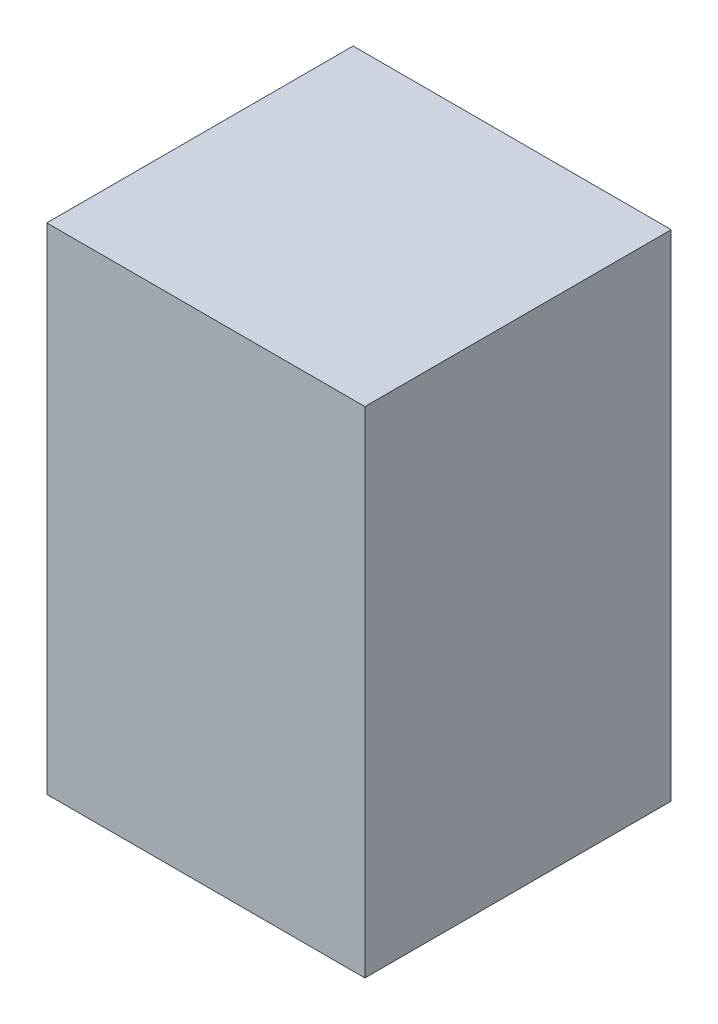
ISO-10303-21;
HEADER;
FILE_DESCRIPTION(('STEP AP214'),'2;1');
FILE_NAME('part.step','',(''),(''),'','','');
FILE_SCHEMA(('AUTOMOTIVE_DESIGN { 1 0 10303 214 1 1 1 1 }'));
ENDSEC;
DATA;
#1=APPLICATION_CONTEXT('core data for automotive mechanical design processes');
#2=APPLICATION_PROTOCOL_DEFINITION('international standard','automotive_design',2000,#1);
#3=PRODUCT_CONTEXT('',#1,'mechanical');
#4=PRODUCT('Part','Part','',(#3));
#5=PRODUCT_RELATED_PRODUCT_CATEGORY('part','',(#4));
#6=PRODUCT_DEFINITION_FORMATION('','',#4);
#7=PRODUCT_DEFINITION_CONTEXT('part definition',#1,'design');
#8=PRODUCT_DEFINITION('design','',#6,#7);
#9=PRODUCT_DEFINITION_SHAPE('','',#8);
#10=(LENGTH_UNIT() NAMED_UNIT(*) SI_UNIT(.MILLI.,.METRE.));
#11=(NAMED_UNIT(*) PLANE_ANGLE_UNIT() SI_UNIT($,.RADIAN.));
#12=(NAMED_UNIT(*) SI_UNIT($,.STERADIAN.) SOLID_ANGLE_UNIT());
#13=UNCERTAINTY_MEASURE_WITH_UNIT(LENGTH_MEASURE(1.E-05),#10,'distance_accuracy_value','');
#14=(GEOMETRIC_REPRESENTATION_CONTEXT(3) GLOBAL_UNCERTAINTY_ASSIGNED_CONTEXT((#13)) GLOBAL_UNIT_ASSIGNED_CONTEXT((#10,
#11,#12)) REPRESENTATION_CONTEXT('',''));
#15=CARTESIAN_POINT('',(0.,0.,0.));
#16=DIRECTION('',(0.,0.,1.));
#17=DIRECTION('',(1.,0.,0.));
#18=AXIS2_PLACEMENT_3D('',#15,#16,#17);
#19=CARTESIAN_POINT('',(0.67499992,1.05000044,1.29999994));
#20=DIRECTION('',(0.,0.,1.));
#21=DIRECTION('',(1.,0.,0.));
#22=AXIS2_PLACEMENT_3D('',#19,#20,#21);
#23=PLANE('',#22);
#24=DIRECTION('',(1.,0.,0.));
#25=VECTOR('',#24,1.);
#26=CARTESIAN_POINT('',(0.67499992,-1.05000044,1.29999994));
#27=LINE('',#26,#25);
#28=CARTESIAN_POINT('',(0.67499992,-1.05000044,1.29999994));
#29=VERTEX_POINT('',#28);
#30=CARTESIAN_POINT('',(-0.67499992,-1.05000044,1.29999994));
#31=VERTEX_POINT('',#30);
#32=EDGE_CURVE('E53',#29,#31,#27,.F.);
#33=ORIENTED_EDGE('',*,*,#32,.F.);
#34=DIRECTION('',(0.,1.,0.));
#35=VECTOR('',#34,1.);
#36=CARTESIAN_POINT('',(0.67499992,1.05000044,1.29999994));
#37=LINE('',#36,#35);
#38=CARTESIAN_POINT('',(0.67499992,1.05000044,1.29999994));
#39=VERTEX_POINT('',#38);
#40=EDGE_CURVE('E68',#39,#29,#37,.F.);
#41=ORIENTED_EDGE('',*,*,#40,.F.);
#42=DIRECTION('',(1.,0.,0.));
#43=VECTOR('',#42,1.);
#44=CARTESIAN_POINT('',(-0.67499992,1.05000044,1.29999994));
#45=LINE('',#44,#43);
#46=CARTESIAN_POINT('',(-0.67499992,1.05000044,1.29999994));
#47=VERTEX_POINT('',#46);
#48=EDGE_CURVE('E20',#47,#39,#45,.T.);
#49=ORIENTED_EDGE('',*,*,#48,.F.);
#50=DIRECTION('',(0.,1.,0.));
#51=VECTOR('',#50,1.);
#52=CARTESIAN_POINT('',(-0.67499992,-1.05000044,1.29999994));
#53=LINE('',#52,#51);
#54=EDGE_CURVE('E58',#31,#47,#53,.T.);
#55=ORIENTED_EDGE('',*,*,#54,.F.);
#56=EDGE_LOOP('',(#33,#41,#49,#55));
#57=FACE_BOUND('',#56,.T.);
#58=ADVANCED_FACE('F17',(#57),#23,.T.);
#59=CARTESIAN_POINT('',(-0.67499992,1.05000044,0.));
#60=DIRECTION('',(0.,1.,0.));
#61=DIRECTION('',(0.,0.,1.));
#62=AXIS2_PLACEMENT_3D('',#59,#60,#61);
#63=PLANE('',#62);
#64=DIRECTION('',(0.,0.,-1.));
#65=VECTOR('',#64,1.);
#66=CARTESIAN_POINT('',(0.67499992,1.05000044,0.));
#67=LINE('',#66,#65);
#68=CARTESIAN_POINT('',(0.67499992,1.05000044,0.));
#69=VERTEX_POINT('',#68);
#70=EDGE_CURVE('E79',#69,#39,#67,.F.);
#71=ORIENTED_EDGE('',*,*,#70,.F.);
#72=DIRECTION('',(1.,0.,0.));
#73=VECTOR('',#72,1.);
#74=CARTESIAN_POINT('',(0.67499992,1.05000044,0.));
#75=LINE('',#74,#73);
#76=CARTESIAN_POINT('',(-0.67499992,1.05000044,0.));
#77=VERTEX_POINT('',#76);
#78=EDGE_CURVE('E74',#69,#77,#75,.F.);
#79=ORIENTED_EDGE('',*,*,#78,.T.);
#80=DIRECTION('',(0.,0.,1.));
#81=VECTOR('',#80,1.);
#82=CARTESIAN_POINT('',(-0.67499992,1.05000044,0.));
#83=LINE('',#82,#81);
#84=EDGE_CURVE('E63',#47,#77,#83,.F.);
#85=ORIENTED_EDGE('',*,*,#84,.F.);
#86=ORIENTED_EDGE('',*,*,#48,.T.);
#87=EDGE_LOOP('',(#71,#79,#85,#86));
#88=FACE_BOUND('',#87,.T.);
#89=ADVANCED_FACE('F73',(#88),#63,.T.);
#90=CARTESIAN_POINT('',(-0.67499992,-1.05000044,0.));
#91=DIRECTION('',(-1.,0.,0.));
#92=DIRECTION('',(0.,0.,1.));
#93=AXIS2_PLACEMENT_3D('',#90,#91,#92);
#94=PLANE('',#93);
#95=ORIENTED_EDGE('',*,*,#84,.T.);
#96=DIRECTION('',(0.,1.,0.));
#97=VECTOR('',#96,1.);
#98=CARTESIAN_POINT('',(-0.67499992,1.05000044,0.));
#99=LINE('',#98,#97);
#100=CARTESIAN_POINT('',(-0.67499992,-1.05000044,0.));
#101=VERTEX_POINT('',#100);
#102=EDGE_CURVE('E84',#77,#101,#99,.F.);
#103=ORIENTED_EDGE('',*,*,#102,.T.);
#104=DIRECTION('',(0.,0.,-1.));
#105=VECTOR('',#104,1.);
#106=CARTESIAN_POINT('',(-0.67499992,-1.05000044,0.));
#107=LINE('',#106,#105);
#108=EDGE_CURVE('E65',#31,#101,#107,.T.);
#109=ORIENTED_EDGE('',*,*,#108,.F.);
#110=ORIENTED_EDGE('',*,*,#54,.T.);
#111=EDGE_LOOP('',(#95,#103,#109,#110));
#112=FACE_BOUND('',#111,.T.);
#113=ADVANCED_FACE('F60',(#112),#94,.T.);
#114=CARTESIAN_POINT('',(0.67499992,-1.05000044,0.));
#115=DIRECTION('',(0.,-1.,0.));
#116=DIRECTION('',(0.,0.,-1.));
#117=AXIS2_PLACEMENT_3D('',#114,#115,#116);
#118=PLANE('',#117);
#119=ORIENTED_EDGE('',*,*,#108,.T.);
#120=DIRECTION('',(1.,0.,0.));
#121=VECTOR('',#120,1.);
#122=CARTESIAN_POINT('',(0.67499992,-1.05000044,0.));
#123=LINE('',#122,#121);
#124=CARTESIAN_POINT('',(0.67499992,-1.05000044,0.));
#125=VERTEX_POINT('',#124);
#126=EDGE_CURVE('E26',#101,#125,#123,.T.);
#127=ORIENTED_EDGE('',*,*,#126,.T.);
#128=DIRECTION('',(0.,0.,-1.));
#129=VECTOR('',#128,1.);
#130=CARTESIAN_POINT('',(0.67499992,-1.05000044,0.));
#131=LINE('',#130,#129);
#132=EDGE_CURVE('E34',#29,#125,#131,.T.);
#133=ORIENTED_EDGE('',*,*,#132,.F.);
#134=ORIENTED_EDGE('',*,*,#32,.T.);
#135=EDGE_LOOP('',(#119,#127,#133,#134));
#136=FACE_BOUND('',#135,.T.);
#137=ADVANCED_FACE('F88',(#136),#118,.T.);
#138=CARTESIAN_POINT('',(0.67499992,1.05000044,0.));
#139=DIRECTION('',(1.,0.,0.));
#140=DIRECTION('',(0.,0.,-1.));
#141=AXIS2_PLACEMENT_3D('',#138,#139,#140);
#142=PLANE('',#141);
#143=ORIENTED_EDGE('',*,*,#132,.T.);
#144=DIRECTION('',(0.,1.,0.));
#145=VECTOR('',#144,1.);
#146=CARTESIAN_POINT('',(0.67499992,1.05000044,0.));
#147=LINE('',#146,#145);
#148=EDGE_CURVE('E11',#125,#69,#147,.T.);
#149=ORIENTED_EDGE('',*,*,#148,.T.);
#150=ORIENTED_EDGE('',*,*,#70,.T.);
#151=ORIENTED_EDGE('',*,*,#40,.T.);
#152=EDGE_LOOP('',(#143,#149,#150,#151));
#153=FACE_BOUND('',#152,.T.);
#154=ADVANCED_FACE('F91',(#153),#142,.T.);
#155=CARTESIAN_POINT('',(0.67499992,1.05000044,0.));
#156=DIRECTION('',(0.,0.,1.));
#157=DIRECTION('',(1.,0.,0.));
#158=AXIS2_PLACEMENT_3D('',#155,#156,#157);
#159=PLANE('',#158);
#160=ORIENTED_EDGE('',*,*,#126,.F.);
#161=ORIENTED_EDGE('',*,*,#102,.F.);
#162=ORIENTED_EDGE('',*,*,#78,.F.);
#163=ORIENTED_EDGE('',*,*,#148,.F.);
#164=EDGE_LOOP('',(#160,#161,#162,#163));
#165=FACE_BOUND('',#164,.T.);
#166=ADVANCED_FACE('F90',(#165),#159,.F.);
#167=CLOSED_SHELL('',(#58,#89,#113,#137,#154,#166));
#168=MANIFOLD_SOLID_BREP('B1',#167);
#169=ADVANCED_BREP_SHAPE_REPRESENTATION('',(#18,#168),#14);
#170=SHAPE_DEFINITION_REPRESENTATION(#9,#169);
ENDSEC;
END-ISO-10303-21;
